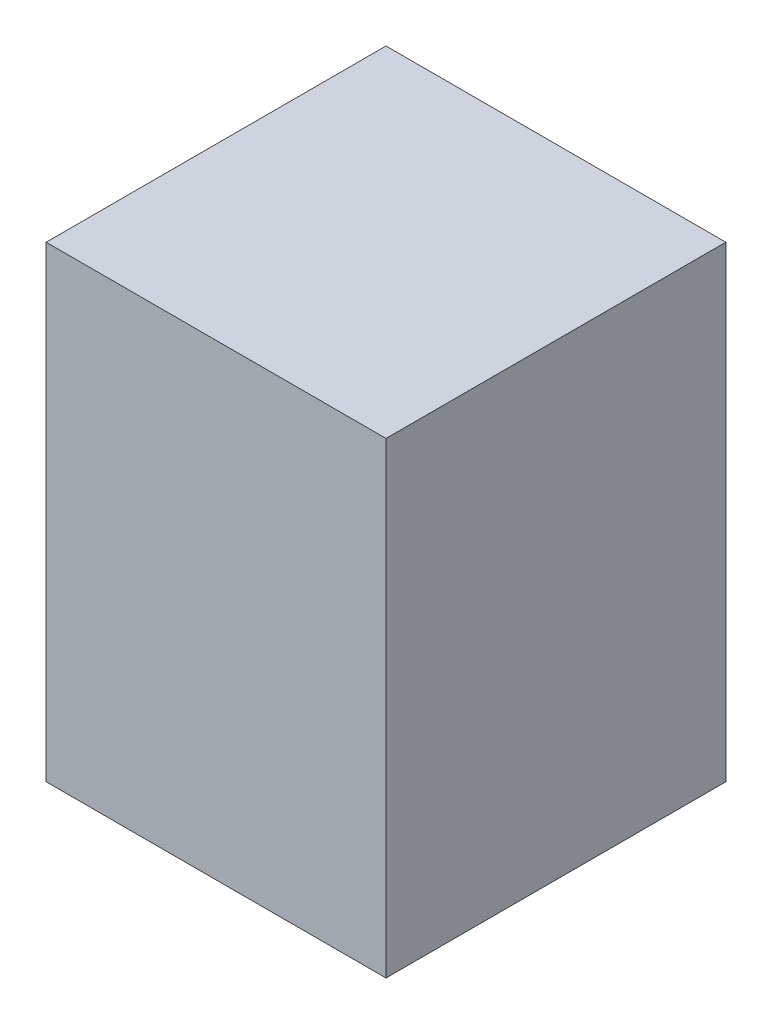
ISO-10303-21;
HEADER;
FILE_DESCRIPTION(('STEP AP214'),'2;1');
FILE_NAME('part.step','',(''),(''),'','','');
FILE_SCHEMA(('AUTOMOTIVE_DESIGN { 1 0 10303 214 1 1 1 1 }'));
ENDSEC;
DATA;
#1=APPLICATION_CONTEXT('core data for automotive mechanical design processes');
#2=APPLICATION_PROTOCOL_DEFINITION('international standard','automotive_design',2000,#1);
#3=PRODUCT_CONTEXT('',#1,'mechanical');
#4=PRODUCT('Part','Part','',(#3));
#5=PRODUCT_RELATED_PRODUCT_CATEGORY('part','',(#4));
#6=PRODUCT_DEFINITION_FORMATION('','',#4);
#7=PRODUCT_DEFINITION_CONTEXT('part definition',#1,'design');
#8=PRODUCT_DEFINITION('design','',#6,#7);
#9=PRODUCT_DEFINITION_SHAPE('','',#8);
#10=(LENGTH_UNIT() NAMED_UNIT(*) SI_UNIT(.MILLI.,.METRE.));
#11=(NAMED_UNIT(*) PLANE_ANGLE_UNIT() SI_UNIT($,.RADIAN.));
#12=(NAMED_UNIT(*) SI_UNIT($,.STERADIAN.) SOLID_ANGLE_UNIT());
#13=UNCERTAINTY_MEASURE_WITH_UNIT(LENGTH_MEASURE(1.E-05),#10,'distance_accuracy_value','');
#14=(GEOMETRIC_REPRESENTATION_CONTEXT(3) GLOBAL_UNCERTAINTY_ASSIGNED_CONTEXT((#13)) GLOBAL_UNIT_ASSIGNED_CONTEXT((#10,
#11,#12)) REPRESENTATION_CONTEXT('',''));
#15=CARTESIAN_POINT('',(0.,0.,0.));
#16=DIRECTION('',(0.,0.,1.));
#17=DIRECTION('',(1.,0.,0.));
#18=AXIS2_PLACEMENT_3D('',#15,#16,#17);
#19=CARTESIAN_POINT('',(5.08,0.,0.));
#20=DIRECTION('',(0.,0.,-1.));
#21=DIRECTION('',(-1.,0.,0.));
#22=AXIS2_PLACEMENT_3D('',#19,#20,#21);
#23=PLANE('',#22);
#24=DIRECTION('',(0.,-1.,0.));
#25=VECTOR('',#24,1.);
#26=CARTESIAN_POINT('',(0.,0.,0.));
#27=LINE('',#26,#25);
#28=CARTESIAN_POINT('',(0.,6.985,0.));
#29=VERTEX_POINT('',#28);
#30=CARTESIAN_POINT('',(0.,0.,0.));
#31=VERTEX_POINT('',#30);
#32=EDGE_CURVE('E96',#29,#31,#27,.T.);
#33=ORIENTED_EDGE('',*,*,#32,.T.);
#34=DIRECTION('',(-1.,0.,0.));
#35=VECTOR('',#34,1.);
#36=CARTESIAN_POINT('',(5.08,0.,0.));
#37=LINE('',#36,#35);
#38=CARTESIAN_POINT('',(5.08,0.,0.));
#39=VERTEX_POINT('',#38);
#40=EDGE_CURVE('E11',#39,#31,#37,.T.);
#41=ORIENTED_EDGE('',*,*,#40,.F.);
#42=DIRECTION('',(0.,-1.,0.));
#43=VECTOR('',#42,1.);
#44=CARTESIAN_POINT('',(5.08,0.,0.));
#45=LINE('',#44,#43);
#46=CARTESIAN_POINT('',(5.08,6.985,0.));
#47=VERTEX_POINT('',#46);
#48=EDGE_CURVE('E84',#47,#39,#45,.T.);
#49=ORIENTED_EDGE('',*,*,#48,.F.);
#50=DIRECTION('',(-1.,0.,0.));
#51=VECTOR('',#50,1.);
#52=CARTESIAN_POINT('',(5.08,6.985,0.));
#53=LINE('',#52,#51);
#54=EDGE_CURVE('E92',#47,#29,#53,.T.);
#55=ORIENTED_EDGE('',*,*,#54,.T.);
#56=EDGE_LOOP('',(#33,#41,#49,#55));
#57=FACE_BOUND('',#56,.T.);
#58=ADVANCED_FACE('F33',(#57),#23,.F.);
#59=CARTESIAN_POINT('',(5.08,0.,0.));
#60=DIRECTION('',(0.,1.,0.));
#61=DIRECTION('',(0.,0.,1.));
#62=AXIS2_PLACEMENT_3D('',#59,#60,#61);
#63=PLANE('',#62);
#64=DIRECTION('',(0.,0.,-1.));
#65=VECTOR('',#64,1.);
#66=CARTESIAN_POINT('',(0.,0.,0.));
#67=LINE('',#66,#65);
#68=CARTESIAN_POINT('',(0.,0.,-5.08));
#69=VERTEX_POINT('',#68);
#70=EDGE_CURVE('E88',#31,#69,#67,.T.);
#71=ORIENTED_EDGE('',*,*,#70,.T.);
#72=DIRECTION('',(-1.,0.,0.));
#73=VECTOR('',#72,1.);
#74=CARTESIAN_POINT('',(5.08,0.,-5.08));
#75=LINE('',#74,#73);
#76=CARTESIAN_POINT('',(5.08,0.,-5.08));
#77=VERTEX_POINT('',#76);
#78=EDGE_CURVE('E41',#77,#69,#75,.T.);
#79=ORIENTED_EDGE('',*,*,#78,.F.);
#80=DIRECTION('',(0.,0.,-1.));
#81=VECTOR('',#80,1.);
#82=CARTESIAN_POINT('',(5.08,0.,0.));
#83=LINE('',#82,#81);
#84=EDGE_CURVE('E79',#39,#77,#83,.T.);
#85=ORIENTED_EDGE('',*,*,#84,.F.);
#86=ORIENTED_EDGE('',*,*,#40,.T.);
#87=EDGE_LOOP('',(#71,#79,#85,#86));
#88=FACE_BOUND('',#87,.T.);
#89=ADVANCED_FACE('F87',(#88),#63,.F.);
#90=CARTESIAN_POINT('',(5.08,0.,-5.08));
#91=DIRECTION('',(0.,0.,1.));
#92=DIRECTION('',(1.,0.,0.));
#93=AXIS2_PLACEMENT_3D('',#90,#91,#92);
#94=PLANE('',#93);
#95=DIRECTION('',(0.,1.,0.));
#96=VECTOR('',#95,1.);
#97=CARTESIAN_POINT('',(0.,0.,-5.08));
#98=LINE('',#97,#96);
#99=CARTESIAN_POINT('',(0.,6.985,-5.08));
#100=VERTEX_POINT('',#99);
#101=EDGE_CURVE('E66',#69,#100,#98,.T.);
#102=ORIENTED_EDGE('',*,*,#101,.T.);
#103=DIRECTION('',(-1.,0.,0.));
#104=VECTOR('',#103,1.);
#105=CARTESIAN_POINT('',(5.08,6.985,-5.08));
#106=LINE('',#105,#104);
#107=CARTESIAN_POINT('',(5.08,6.985,-5.08));
#108=VERTEX_POINT('',#107);
#109=EDGE_CURVE('E89',#108,#100,#106,.T.);
#110=ORIENTED_EDGE('',*,*,#109,.F.);
#111=DIRECTION('',(0.,1.,0.));
#112=VECTOR('',#111,1.);
#113=CARTESIAN_POINT('',(5.08,0.,-5.08));
#114=LINE('',#113,#112);
#115=EDGE_CURVE('E82',#77,#108,#114,.T.);
#116=ORIENTED_EDGE('',*,*,#115,.F.);
#117=ORIENTED_EDGE('',*,*,#78,.T.);
#118=EDGE_LOOP('',(#102,#110,#116,#117));
#119=FACE_BOUND('',#118,.T.);
#120=ADVANCED_FACE('F90',(#119),#94,.F.);
#121=CARTESIAN_POINT('',(5.08,6.985,0.));
#122=DIRECTION('',(0.,-1.,0.));
#123=DIRECTION('',(0.,0.,-1.));
#124=AXIS2_PLACEMENT_3D('',#121,#122,#123);
#125=PLANE('',#124);
#126=DIRECTION('',(0.,0.,1.));
#127=VECTOR('',#126,1.);
#128=CARTESIAN_POINT('',(0.,6.985,0.));
#129=LINE('',#128,#127);
#130=EDGE_CURVE('E72',#100,#29,#129,.T.);
#131=ORIENTED_EDGE('',*,*,#130,.T.);
#132=ORIENTED_EDGE('',*,*,#54,.F.);
#133=DIRECTION('',(0.,0.,1.));
#134=VECTOR('',#133,1.);
#135=CARTESIAN_POINT('',(5.08,6.985,0.));
#136=LINE('',#135,#134);
#137=EDGE_CURVE('E49',#108,#47,#136,.T.);
#138=ORIENTED_EDGE('',*,*,#137,.F.);
#139=ORIENTED_EDGE('',*,*,#109,.T.);
#140=EDGE_LOOP('',(#131,#132,#138,#139));
#141=FACE_BOUND('',#140,.T.);
#142=ADVANCED_FACE('F103',(#141),#125,.F.);
#143=CARTESIAN_POINT('',(5.08,0.,0.));
#144=DIRECTION('',(-1.,0.,0.));
#145=DIRECTION('',(0.,0.,1.));
#146=AXIS2_PLACEMENT_3D('',#143,#144,#145);
#147=PLANE('',#146);
#148=ORIENTED_EDGE('',*,*,#48,.T.);
#149=ORIENTED_EDGE('',*,*,#84,.T.);
#150=ORIENTED_EDGE('',*,*,#115,.T.);
#151=ORIENTED_EDGE('',*,*,#137,.T.);
#152=EDGE_LOOP('',(#148,#149,#150,#151));
#153=FACE_BOUND('',#152,.T.);
#154=ADVANCED_FACE('F80',(#153),#147,.F.);
#155=CARTESIAN_POINT('',(0.,0.,0.));
#156=DIRECTION('',(-1.,0.,0.));
#157=DIRECTION('',(0.,0.,1.));
#158=AXIS2_PLACEMENT_3D('',#155,#156,#157);
#159=PLANE('',#158);
#160=ORIENTED_EDGE('',*,*,#32,.F.);
#161=ORIENTED_EDGE('',*,*,#130,.F.);
#162=ORIENTED_EDGE('',*,*,#101,.F.);
#163=ORIENTED_EDGE('',*,*,#70,.F.);
#164=EDGE_LOOP('',(#160,#161,#162,#163));
#165=FACE_BOUND('',#164,.T.);
#166=ADVANCED_FACE('F106',(#165),#159,.T.);
#167=CLOSED_SHELL('',(#58,#89,#120,#142,#154,#166));
#168=MANIFOLD_SOLID_BREP('B2',#167);
#169=ADVANCED_BREP_SHAPE_REPRESENTATION('',(#18,#168),#14);
#170=SHAPE_DEFINITION_REPRESENTATION(#9,#169);
ENDSEC;
END-ISO-10303-21;
